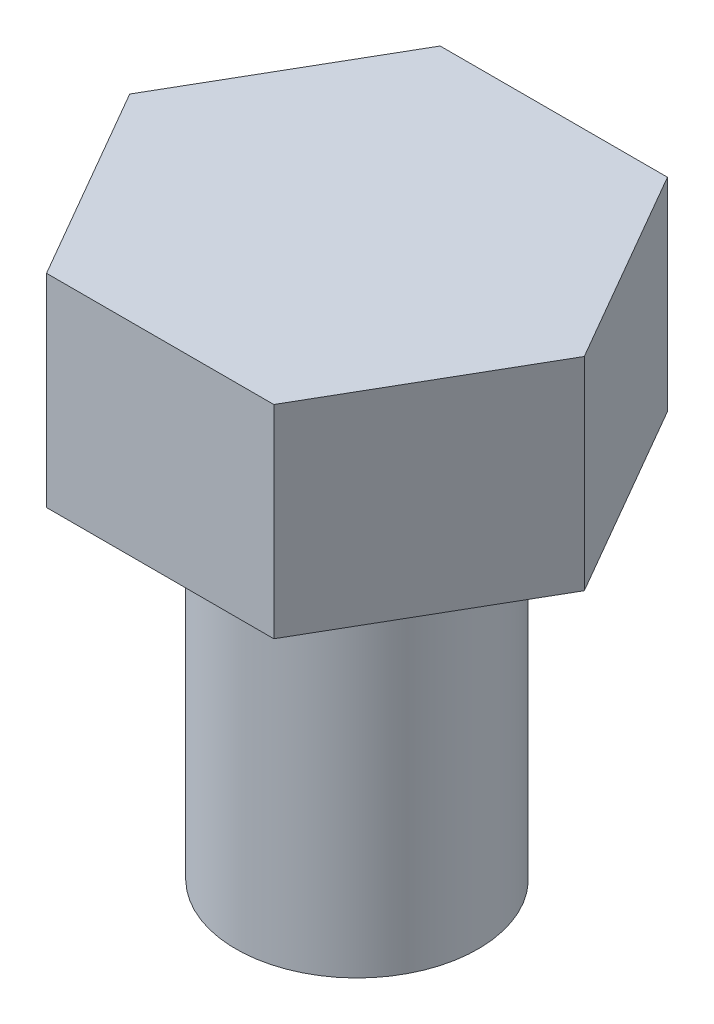
ISO-10303-21;
HEADER;
FILE_DESCRIPTION(('STEP AP214'),'2;1');
FILE_NAME('part.step','',(''),(''),'','','');
FILE_SCHEMA(('AUTOMOTIVE_DESIGN { 1 0 10303 214 1 1 1 1 }'));
ENDSEC;
DATA;
#1=APPLICATION_CONTEXT('core data for automotive mechanical design processes');
#2=APPLICATION_PROTOCOL_DEFINITION('international standard','automotive_design',2000,#1);
#3=PRODUCT_CONTEXT('',#1,'mechanical');
#4=PRODUCT('Part','Part','',(#3));
#5=PRODUCT_RELATED_PRODUCT_CATEGORY('part','',(#4));
#6=PRODUCT_DEFINITION_FORMATION('','',#4);
#7=PRODUCT_DEFINITION_CONTEXT('part definition',#1,'design');
#8=PRODUCT_DEFINITION('design','',#6,#7);
#9=PRODUCT_DEFINITION_SHAPE('','',#8);
#10=(LENGTH_UNIT() NAMED_UNIT(*) SI_UNIT(.MILLI.,.METRE.));
#11=(NAMED_UNIT(*) PLANE_ANGLE_UNIT() SI_UNIT($,.RADIAN.));
#12=(NAMED_UNIT(*) SI_UNIT($,.STERADIAN.) SOLID_ANGLE_UNIT());
#13=UNCERTAINTY_MEASURE_WITH_UNIT(LENGTH_MEASURE(1.E-05),#10,'distance_accuracy_value','');
#14=(GEOMETRIC_REPRESENTATION_CONTEXT(3) GLOBAL_UNCERTAINTY_ASSIGNED_CONTEXT((#13)) GLOBAL_UNIT_ASSIGNED_CONTEXT((#10,
#11,#12)) REPRESENTATION_CONTEXT('',''));
#15=CARTESIAN_POINT('',(0.,0.,0.));
#16=DIRECTION('',(0.,0.,1.));
#17=DIRECTION('',(1.,0.,0.));
#18=AXIS2_PLACEMENT_3D('',#15,#16,#17);
#19=CARTESIAN_POINT('',(3.75277674973257,6.7,6.5));
#20=DIRECTION('',(-0.866025403784439,0.,-0.5));
#21=DIRECTION('',(-0.5,0.,0.866025403784439));
#22=AXIS2_PLACEMENT_3D('',#19,#20,#21);
#23=PLANE('',#22);
#24=DIRECTION('',(0.5,0.,-0.866025403784439));
#25=VECTOR('',#24,1.);
#26=CARTESIAN_POINT('',(3.75277674973257,0.,6.5));
#27=LINE('',#26,#25);
#28=CARTESIAN_POINT('',(3.75277674973257,0.,6.5));
#29=VERTEX_POINT('',#28);
#30=CARTESIAN_POINT('',(7.50555349946513,0.,0.));
#31=VERTEX_POINT('',#30);
#32=EDGE_CURVE('E119',#29,#31,#27,.T.);
#33=ORIENTED_EDGE('',*,*,#32,.T.);
#34=DIRECTION('',(0.,-1.,0.));
#35=VECTOR('',#34,1.);
#36=CARTESIAN_POINT('',(7.50555349946513,6.7,0.));
#37=LINE('',#36,#35);
#38=CARTESIAN_POINT('',(7.50555349946513,6.7,0.));
#39=VERTEX_POINT('',#38);
#40=EDGE_CURVE('E36',#39,#31,#37,.T.);
#41=ORIENTED_EDGE('',*,*,#40,.F.);
#42=DIRECTION('',(0.5,0.,-0.866025403784439));
#43=VECTOR('',#42,1.);
#44=CARTESIAN_POINT('',(3.75277674973257,6.7,6.5));
#45=LINE('',#44,#43);
#46=CARTESIAN_POINT('',(3.75277674973257,6.7,6.5));
#47=VERTEX_POINT('',#46);
#48=EDGE_CURVE('E130',#47,#39,#45,.T.);
#49=ORIENTED_EDGE('',*,*,#48,.F.);
#50=DIRECTION('',(0.,-1.,0.));
#51=VECTOR('',#50,1.);
#52=CARTESIAN_POINT('',(3.75277674973257,6.7,6.5));
#53=LINE('',#52,#51);
#54=EDGE_CURVE('E115',#47,#29,#53,.T.);
#55=ORIENTED_EDGE('',*,*,#54,.T.);
#56=EDGE_LOOP('',(#33,#41,#49,#55));
#57=FACE_BOUND('',#56,.T.);
#58=ADVANCED_FACE('F33',(#57),#23,.F.);
#59=CARTESIAN_POINT('',(7.50555349946513,6.7,0.));
#60=DIRECTION('',(-0.866025403784439,0.,0.5));
#61=DIRECTION('',(0.5,0.,0.866025403784439));
#62=AXIS2_PLACEMENT_3D('',#59,#60,#61);
#63=PLANE('',#62);
#64=DIRECTION('',(-0.5,0.,-0.866025403784439));
#65=VECTOR('',#64,1.);
#66=CARTESIAN_POINT('',(7.50555349946513,0.,0.));
#67=LINE('',#66,#65);
#68=CARTESIAN_POINT('',(3.75277674973256,0.,-6.5));
#69=VERTEX_POINT('',#68);
#70=EDGE_CURVE('E122',#31,#69,#67,.T.);
#71=ORIENTED_EDGE('',*,*,#70,.T.);
#72=DIRECTION('',(0.,-1.,0.));
#73=VECTOR('',#72,1.);
#74=CARTESIAN_POINT('',(3.75277674973256,6.7,-6.5));
#75=LINE('',#74,#73);
#76=CARTESIAN_POINT('',(3.75277674973256,6.7,-6.5));
#77=VERTEX_POINT('',#76);
#78=EDGE_CURVE('E133',#77,#69,#75,.T.);
#79=ORIENTED_EDGE('',*,*,#78,.F.);
#80=DIRECTION('',(-0.5,0.,-0.866025403784439));
#81=VECTOR('',#80,1.);
#82=CARTESIAN_POINT('',(7.50555349946513,6.7,0.));
#83=LINE('',#82,#81);
#84=EDGE_CURVE('E88',#39,#77,#83,.T.);
#85=ORIENTED_EDGE('',*,*,#84,.F.);
#86=ORIENTED_EDGE('',*,*,#40,.T.);
#87=EDGE_LOOP('',(#71,#79,#85,#86));
#88=FACE_BOUND('',#87,.T.);
#89=ADVANCED_FACE('F138',(#88),#63,.F.);
#90=CARTESIAN_POINT('',(3.75277674973256,6.7,-6.5));
#91=DIRECTION('',(0.,0.,1.));
#92=DIRECTION('',(1.,0.,0.));
#93=AXIS2_PLACEMENT_3D('',#90,#91,#92);
#94=PLANE('',#93);
#95=DIRECTION('',(-1.,0.,0.));
#96=VECTOR('',#95,1.);
#97=CARTESIAN_POINT('',(3.75277674973256,0.,-6.5));
#98=LINE('',#97,#96);
#99=CARTESIAN_POINT('',(-3.75277674973257,0.,-6.5));
#100=VERTEX_POINT('',#99);
#101=EDGE_CURVE('E125',#69,#100,#98,.T.);
#102=ORIENTED_EDGE('',*,*,#101,.T.);
#103=DIRECTION('',(0.,-1.,0.));
#104=VECTOR('',#103,1.);
#105=CARTESIAN_POINT('',(-3.75277674973257,6.7,-6.5));
#106=LINE('',#105,#104);
#107=CARTESIAN_POINT('',(-3.75277674973257,6.7,-6.5));
#108=VERTEX_POINT('',#107);
#109=EDGE_CURVE('E110',#108,#100,#106,.T.);
#110=ORIENTED_EDGE('',*,*,#109,.F.);
#111=DIRECTION('',(-1.,0.,0.));
#112=VECTOR('',#111,1.);
#113=CARTESIAN_POINT('',(3.75277674973256,6.7,-6.5));
#114=LINE('',#113,#112);
#115=EDGE_CURVE('E101',#77,#108,#114,.T.);
#116=ORIENTED_EDGE('',*,*,#115,.F.);
#117=ORIENTED_EDGE('',*,*,#78,.T.);
#118=EDGE_LOOP('',(#102,#110,#116,#117));
#119=FACE_BOUND('',#118,.T.);
#120=ADVANCED_FACE('F144',(#119),#94,.F.);
#121=CARTESIAN_POINT('',(-3.75277674973257,6.7,-6.5));
#122=DIRECTION('',(0.866025403784439,0.,0.5));
#123=DIRECTION('',(0.5,0.,-0.866025403784439));
#124=AXIS2_PLACEMENT_3D('',#121,#122,#123);
#125=PLANE('',#124);
#126=DIRECTION('',(-0.5,0.,0.866025403784439));
#127=VECTOR('',#126,1.);
#128=CARTESIAN_POINT('',(-3.75277674973257,0.,-6.5));
#129=LINE('',#128,#127);
#130=CARTESIAN_POINT('',(-7.50555349946514,0.,0.));
#131=VERTEX_POINT('',#130);
#132=EDGE_CURVE('E109',#100,#131,#129,.T.);
#133=ORIENTED_EDGE('',*,*,#132,.T.);
#134=DIRECTION('',(0.,-1.,0.));
#135=VECTOR('',#134,1.);
#136=CARTESIAN_POINT('',(-7.50555349946514,6.7,0.));
#137=LINE('',#136,#135);
#138=CARTESIAN_POINT('',(-7.50555349946514,6.7,0.));
#139=VERTEX_POINT('',#138);
#140=EDGE_CURVE('E106',#139,#131,#137,.T.);
#141=ORIENTED_EDGE('',*,*,#140,.F.);
#142=DIRECTION('',(-0.5,0.,0.866025403784439));
#143=VECTOR('',#142,1.);
#144=CARTESIAN_POINT('',(-3.75277674973257,6.7,-6.5));
#145=LINE('',#144,#143);
#146=EDGE_CURVE('E95',#108,#139,#145,.T.);
#147=ORIENTED_EDGE('',*,*,#146,.F.);
#148=ORIENTED_EDGE('',*,*,#109,.T.);
#149=EDGE_LOOP('',(#133,#141,#147,#148));
#150=FACE_BOUND('',#149,.T.);
#151=ADVANCED_FACE('F107',(#150),#125,.F.);
#152=CARTESIAN_POINT('',(-7.50555349946514,6.7,0.));
#153=DIRECTION('',(0.866025403784439,0.,-0.5));
#154=DIRECTION('',(-0.5,0.,-0.866025403784439));
#155=AXIS2_PLACEMENT_3D('',#152,#153,#154);
#156=PLANE('',#155);
#157=DIRECTION('',(0.5,0.,0.866025403784439));
#158=VECTOR('',#157,1.);
#159=CARTESIAN_POINT('',(-7.50555349946514,0.,0.));
#160=LINE('',#159,#158);
#161=CARTESIAN_POINT('',(-3.75277674973257,0.,6.5));
#162=VERTEX_POINT('',#161);
#163=EDGE_CURVE('E73',#131,#162,#160,.T.);
#164=ORIENTED_EDGE('',*,*,#163,.T.);
#165=DIRECTION('',(0.,-1.,0.));
#166=VECTOR('',#165,1.);
#167=CARTESIAN_POINT('',(-3.75277674973257,6.7,6.5));
#168=LINE('',#167,#166);
#169=CARTESIAN_POINT('',(-3.75277674973257,6.7,6.5));
#170=VERTEX_POINT('',#169);
#171=EDGE_CURVE('E111',#170,#162,#168,.T.);
#172=ORIENTED_EDGE('',*,*,#171,.F.);
#173=DIRECTION('',(0.5,0.,0.866025403784439));
#174=VECTOR('',#173,1.);
#175=CARTESIAN_POINT('',(-7.50555349946514,6.7,0.));
#176=LINE('',#175,#174);
#177=EDGE_CURVE('E99',#139,#170,#176,.T.);
#178=ORIENTED_EDGE('',*,*,#177,.F.);
#179=ORIENTED_EDGE('',*,*,#140,.T.);
#180=EDGE_LOOP('',(#164,#172,#178,#179));
#181=FACE_BOUND('',#180,.T.);
#182=ADVANCED_FACE('F113',(#181),#156,.F.);
#183=CARTESIAN_POINT('',(-3.75277674973257,6.7,6.5));
#184=DIRECTION('',(0.,0.,-1.));
#185=DIRECTION('',(-1.,0.,0.));
#186=AXIS2_PLACEMENT_3D('',#183,#184,#185);
#187=PLANE('',#186);
#188=DIRECTION('',(1.,0.,0.));
#189=VECTOR('',#188,1.);
#190=CARTESIAN_POINT('',(-3.75277674973257,0.,6.5));
#191=LINE('',#190,#189);
#192=EDGE_CURVE('E79',#162,#29,#191,.T.);
#193=ORIENTED_EDGE('',*,*,#192,.T.);
#194=ORIENTED_EDGE('',*,*,#54,.F.);
#195=DIRECTION('',(1.,0.,0.));
#196=VECTOR('',#195,1.);
#197=CARTESIAN_POINT('',(-3.75277674973257,6.7,6.5));
#198=LINE('',#197,#196);
#199=EDGE_CURVE('E50',#170,#47,#198,.T.);
#200=ORIENTED_EDGE('',*,*,#199,.F.);
#201=ORIENTED_EDGE('',*,*,#171,.T.);
#202=EDGE_LOOP('',(#193,#194,#200,#201));
#203=FACE_BOUND('',#202,.T.);
#204=ADVANCED_FACE('F164',(#203),#187,.F.);
#205=CARTESIAN_POINT('',(0.,6.7,0.));
#206=DIRECTION('',(0.,1.,0.));
#207=DIRECTION('',(0.,0.,1.));
#208=AXIS2_PLACEMENT_3D('',#205,#206,#207);
#209=PLANE('',#208);
#210=ORIENTED_EDGE('',*,*,#48,.T.);
#211=ORIENTED_EDGE('',*,*,#84,.T.);
#212=ORIENTED_EDGE('',*,*,#115,.T.);
#213=ORIENTED_EDGE('',*,*,#146,.T.);
#214=ORIENTED_EDGE('',*,*,#177,.T.);
#215=ORIENTED_EDGE('',*,*,#199,.T.);
#216=EDGE_LOOP('',(#210,#211,#212,#213,#214,#215));
#217=FACE_BOUND('',#216,.T.);
#218=ADVANCED_FACE('F97',(#217),#209,.T.);
#219=CARTESIAN_POINT('',(0.,0.,0.));
#220=DIRECTION('',(0.,1.,0.));
#221=DIRECTION('',(0.,0.,1.));
#222=AXIS2_PLACEMENT_3D('',#219,#220,#221);
#223=PLANE('',#222);
#224=CARTESIAN_POINT('',(0.,0.,0.));
#225=DIRECTION('',(0.,-1.,0.));
#226=DIRECTION('',(0.,0.,-1.));
#227=AXIS2_PLACEMENT_3D('',#224,#225,#226);
#228=CIRCLE('',#227,4.);
#229=CARTESIAN_POINT('',(0.,0.,-4.));
#230=VERTEX_POINT('',#229);
#231=EDGE_CURVE('E11',#230,#230,#228,.T.);
#232=ORIENTED_EDGE('',*,*,#231,.F.);
#233=EDGE_LOOP('',(#232));
#234=FACE_BOUND('',#233,.T.);
#235=ORIENTED_EDGE('',*,*,#32,.F.);
#236=ORIENTED_EDGE('',*,*,#192,.F.);
#237=ORIENTED_EDGE('',*,*,#163,.F.);
#238=ORIENTED_EDGE('',*,*,#132,.F.);
#239=ORIENTED_EDGE('',*,*,#101,.F.);
#240=ORIENTED_EDGE('',*,*,#70,.F.);
#241=EDGE_LOOP('',(#235,#236,#237,#238,#239,#240));
#242=FACE_BOUND('',#241,.T.);
#243=ADVANCED_FACE('F143',(#234,#242),#223,.F.);
#244=CARTESIAN_POINT('',(0.,-12.,0.));
#245=DIRECTION('',(0.,1.,0.));
#246=DIRECTION('',(0.,0.,1.));
#247=AXIS2_PLACEMENT_3D('',#244,#245,#246);
#248=CYLINDRICAL_SURFACE('',#247,4.);
#249=CARTESIAN_POINT('',(0.,-12.,0.));
#250=DIRECTION('',(0.,-1.,0.));
#251=DIRECTION('',(0.,0.,-1.));
#252=AXIS2_PLACEMENT_3D('',#249,#250,#251);
#253=CIRCLE('',#252,4.);
#254=CARTESIAN_POINT('',(0.,-12.,-4.));
#255=VERTEX_POINT('',#254);
#256=EDGE_CURVE('E123',#255,#255,#253,.T.);
#257=ORIENTED_EDGE('',*,*,#256,.F.);
#258=EDGE_LOOP('',(#257));
#259=FACE_BOUND('',#258,.T.);
#260=ORIENTED_EDGE('',*,*,#231,.T.);
#261=EDGE_LOOP('',(#260));
#262=FACE_BOUND('',#261,.T.);
#263=ADVANCED_FACE('F153',(#259,#262),#248,.T.);
#264=CARTESIAN_POINT('',(0.,-12.,0.));
#265=DIRECTION('',(0.,-1.,0.));
#266=DIRECTION('',(0.,0.,-1.));
#267=AXIS2_PLACEMENT_3D('',#264,#265,#266);
#268=PLANE('',#267);
#269=ORIENTED_EDGE('',*,*,#256,.T.);
#270=EDGE_LOOP('',(#269));
#271=FACE_BOUND('',#270,.T.);
#272=ADVANCED_FACE('F151',(#271),#268,.T.);
#273=CLOSED_SHELL('',(#58,#89,#120,#151,#182,#204,#218,#243,#263,#272));
#274=MANIFOLD_SOLID_BREP('B2',#273);
#275=ADVANCED_BREP_SHAPE_REPRESENTATION('',(#18,#274),#14);
#276=SHAPE_DEFINITION_REPRESENTATION(#9,#275);
ENDSEC;
END-ISO-10303-21;
